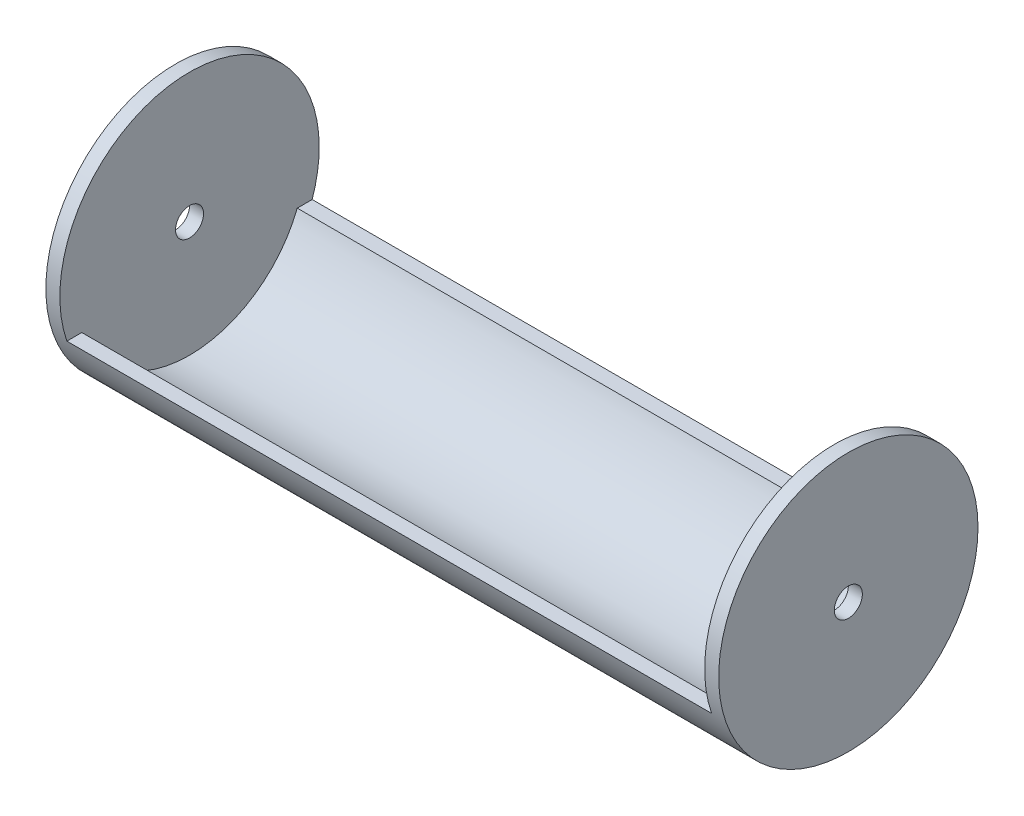
ISO-10303-21;
HEADER;
FILE_DESCRIPTION(('STEP AP214'),'2;1');
FILE_NAME('part.step','',(''),(''),'','','');
FILE_SCHEMA(('AUTOMOTIVE_DESIGN { 1 0 10303 214 1 1 1 1 }'));
ENDSEC;
DATA;
#1=APPLICATION_CONTEXT('core data for automotive mechanical design processes');
#2=APPLICATION_PROTOCOL_DEFINITION('international standard','automotive_design',2000,#1);
#3=PRODUCT_CONTEXT('',#1,'mechanical');
#4=PRODUCT('Part','Part','',(#3));
#5=PRODUCT_RELATED_PRODUCT_CATEGORY('part','',(#4));
#6=PRODUCT_DEFINITION_FORMATION('','',#4);
#7=PRODUCT_DEFINITION_CONTEXT('part definition',#1,'design');
#8=PRODUCT_DEFINITION('design','',#6,#7);
#9=PRODUCT_DEFINITION_SHAPE('','',#8);
#10=(LENGTH_UNIT() NAMED_UNIT(*) SI_UNIT(.MILLI.,.METRE.));
#11=(NAMED_UNIT(*) PLANE_ANGLE_UNIT() SI_UNIT($,.RADIAN.));
#12=(NAMED_UNIT(*) SI_UNIT($,.STERADIAN.) SOLID_ANGLE_UNIT());
#13=UNCERTAINTY_MEASURE_WITH_UNIT(LENGTH_MEASURE(1.E-05),#10,'distance_accuracy_value','');
#14=(GEOMETRIC_REPRESENTATION_CONTEXT(3) GLOBAL_UNCERTAINTY_ASSIGNED_CONTEXT((#13)) GLOBAL_UNIT_ASSIGNED_CONTEXT((#10,
#11,#12)) REPRESENTATION_CONTEXT('',''));
#15=CARTESIAN_POINT('',(0.,0.,0.));
#16=DIRECTION('',(0.,0.,1.));
#17=DIRECTION('',(1.,0.,0.));
#18=AXIS2_PLACEMENT_3D('',#15,#16,#17);
#19=CARTESIAN_POINT('',(-146.05,-19.05,-58.7375));
#20=DIRECTION('',(0.,-1.,0.));
#21=DIRECTION('',(0.,0.,-1.));
#22=AXIS2_PLACEMENT_3D('',#19,#20,#21);
#23=PLANE('',#22);
#24=DIRECTION('',(0.,0.,1.));
#25=VECTOR('',#24,1.);
#26=CARTESIAN_POINT('',(-146.05,-19.05,-58.7375));
#27=LINE('',#26,#25);
#28=CARTESIAN_POINT('',(-146.05,-19.05,-55.5625));
#29=VERTEX_POINT('',#28);
#30=CARTESIAN_POINT('',(-146.05,-19.05,-48.8011030228826));
#31=VERTEX_POINT('',#30);
#32=EDGE_CURVE('E103',#29,#31,#27,.T.);
#33=ORIENTED_EDGE('',*,*,#32,.T.);
#34=DIRECTION('',(-1.,0.,0.));
#35=VECTOR('',#34,1.);
#36=CARTESIAN_POINT('',(-152.4,-19.05,-48.8011030228826));
#37=LINE('',#36,#35);
#38=CARTESIAN_POINT('',(146.05,-19.05,-48.8011030228826));
#39=VERTEX_POINT('',#38);
#40=EDGE_CURVE('E93',#31,#39,#37,.F.);
#41=ORIENTED_EDGE('',*,*,#40,.T.);
#42=DIRECTION('',(0.,0.,1.));
#43=VECTOR('',#42,1.);
#44=CARTESIAN_POINT('',(146.05,-19.05,-58.7375));
#45=LINE('',#44,#43);
#46=CARTESIAN_POINT('',(146.05,-19.05,-55.5625));
#47=VERTEX_POINT('',#46);
#48=EDGE_CURVE('E100',#47,#39,#45,.T.);
#49=ORIENTED_EDGE('',*,*,#48,.F.);
#50=DIRECTION('',(-1.,0.,0.));
#51=VECTOR('',#50,1.);
#52=CARTESIAN_POINT('',(152.4,-19.05,-55.5625));
#53=LINE('',#52,#51);
#54=EDGE_CURVE('E11',#29,#47,#53,.F.);
#55=ORIENTED_EDGE('',*,*,#54,.F.);
#56=EDGE_LOOP('',(#33,#41,#49,#55));
#57=FACE_BOUND('',#56,.T.);
#58=ADVANCED_FACE('F50',(#57),#23,.F.);
#59=CARTESIAN_POINT('',(152.4,0.,0.));
#60=DIRECTION('',(-1.,0.,0.));
#61=DIRECTION('',(0.,0.,1.));
#62=AXIS2_PLACEMENT_3D('',#59,#60,#61);
#63=CYLINDRICAL_SURFACE('',#62,6.35);
#64=CARTESIAN_POINT('',(-146.05,0.,0.));
#65=DIRECTION('',(-1.,0.,0.));
#66=DIRECTION('',(0.,0.,1.));
#67=AXIS2_PLACEMENT_3D('',#64,#65,#66);
#68=CIRCLE('',#67,6.35);
#69=CARTESIAN_POINT('',(-146.05,0.,6.35));
#70=VERTEX_POINT('',#69);
#71=EDGE_CURVE('E119',#70,#70,#68,.T.);
#72=CARTESIAN_POINT('',(-152.4,0.,0.));
#73=DIRECTION('',(1.,0.,0.));
#74=DIRECTION('',(0.,0.,-1.));
#75=AXIS2_PLACEMENT_3D('',#72,#73,#74);
#76=CIRCLE('',#75,6.35);
#77=CARTESIAN_POINT('',(-152.4,0.,6.35));
#78=VERTEX_POINT('',#77);
#79=EDGE_CURVE('E121',#78,#78,#76,.T.);
#80=CARTESIAN_POINT('',(-146.05,0.,6.35));
#81=CARTESIAN_POINT('',(-146.116145833333,0.,6.35));
#82=CARTESIAN_POINT('',(-146.182291666667,0.,6.35));
#83=CARTESIAN_POINT('',(-146.314583333333,0.,6.35));
#84=CARTESIAN_POINT('',(-146.380729166667,0.,6.35));
#85=CARTESIAN_POINT('',(-146.513020833333,0.,6.35));
#86=CARTESIAN_POINT('',(-146.579166666667,0.,6.35));
#87=CARTESIAN_POINT('',(-146.711458333333,0.,6.35));
#88=CARTESIAN_POINT('',(-146.777604166667,0.,6.35));
#89=CARTESIAN_POINT('',(-146.909895833333,0.,6.35));
#90=CARTESIAN_POINT('',(-146.976041666667,0.,6.35));
#91=CARTESIAN_POINT('',(-147.108333333333,0.,6.35));
#92=CARTESIAN_POINT('',(-147.174479166667,0.,6.35));
#93=CARTESIAN_POINT('',(-147.306770833333,0.,6.35));
#94=CARTESIAN_POINT('',(-147.372916666667,0.,6.35));
#95=CARTESIAN_POINT('',(-147.505208333333,0.,6.35));
#96=CARTESIAN_POINT('',(-147.571354166667,0.,6.35));
#97=CARTESIAN_POINT('',(-147.703645833333,0.,6.35));
#98=CARTESIAN_POINT('',(-147.769791666667,0.,6.35));
#99=CARTESIAN_POINT('',(-147.902083333333,0.,6.35));
#100=CARTESIAN_POINT('',(-147.968229166667,0.,6.35));
#101=CARTESIAN_POINT('',(-148.100520833333,0.,6.35));
#102=CARTESIAN_POINT('',(-148.166666666667,0.,6.35));
#103=CARTESIAN_POINT('',(-148.298958333333,0.,6.35));
#104=CARTESIAN_POINT('',(-148.365104166667,0.,6.35));
#105=CARTESIAN_POINT('',(-148.497395833333,0.,6.35));
#106=CARTESIAN_POINT('',(-148.563541666667,0.,6.35));
#107=CARTESIAN_POINT('',(-148.695833333333,0.,6.35));
#108=CARTESIAN_POINT('',(-148.761979166667,0.,6.35));
#109=CARTESIAN_POINT('',(-148.894270833333,0.,6.35));
#110=CARTESIAN_POINT('',(-148.960416666667,0.,6.35));
#111=CARTESIAN_POINT('',(-149.092708333333,0.,6.35));
#112=CARTESIAN_POINT('',(-149.158854166667,0.,6.35));
#113=CARTESIAN_POINT('',(-149.291145833333,0.,6.35));
#114=CARTESIAN_POINT('',(-149.357291666667,0.,6.35));
#115=CARTESIAN_POINT('',(-149.489583333333,0.,6.35));
#116=CARTESIAN_POINT('',(-149.555729166667,0.,6.35));
#117=CARTESIAN_POINT('',(-149.688020833333,0.,6.35));
#118=CARTESIAN_POINT('',(-149.754166666667,0.,6.35));
#119=CARTESIAN_POINT('',(-149.886458333333,0.,6.35));
#120=CARTESIAN_POINT('',(-149.952604166667,0.,6.35));
#121=CARTESIAN_POINT('',(-150.084895833333,0.,6.35));
#122=CARTESIAN_POINT('',(-150.151041666667,0.,6.35));
#123=CARTESIAN_POINT('',(-150.283333333333,0.,6.35));
#124=CARTESIAN_POINT('',(-150.349479166667,0.,6.35));
#125=CARTESIAN_POINT('',(-150.481770833333,0.,6.35));
#126=CARTESIAN_POINT('',(-150.547916666667,0.,6.35));
#127=CARTESIAN_POINT('',(-150.680208333333,0.,6.35));
#128=CARTESIAN_POINT('',(-150.746354166667,0.,6.35));
#129=CARTESIAN_POINT('',(-150.878645833333,0.,6.35));
#130=CARTESIAN_POINT('',(-150.944791666667,0.,6.35));
#131=CARTESIAN_POINT('',(-151.077083333333,0.,6.35));
#132=CARTESIAN_POINT('',(-151.143229166667,0.,6.35));
#133=CARTESIAN_POINT('',(-151.275520833333,0.,6.35));
#134=CARTESIAN_POINT('',(-151.341666666667,0.,6.35));
#135=CARTESIAN_POINT('',(-151.473958333333,0.,6.35));
#136=CARTESIAN_POINT('',(-151.540104166667,0.,6.35));
#137=CARTESIAN_POINT('',(-151.672395833333,0.,6.35));
#138=CARTESIAN_POINT('',(-151.738541666667,0.,6.35));
#139=CARTESIAN_POINT('',(-151.870833333333,0.,6.35));
#140=CARTESIAN_POINT('',(-151.936979166667,0.,6.35));
#141=CARTESIAN_POINT('',(-152.069270833333,0.,6.35));
#142=CARTESIAN_POINT('',(-152.135416666667,0.,6.35));
#143=CARTESIAN_POINT('',(-152.267708333333,0.,6.35));
#144=CARTESIAN_POINT('',(-152.333854166667,0.,6.35));
#145=CARTESIAN_POINT('',(-152.4,0.,6.35));
#146=B_SPLINE_CURVE_WITH_KNOTS('',3,(#80,#81,#82,#83,#84,#85,#86,#87,#88,#89,#90,#91,#92,#93,
#94,#95,#96,#97,#98,#99,#100,#101,#102,#103,#104,#105,#106,#107,#108,#109,#110,#111,#112,#113,
#114,#115,#116,#117,#118,#119,#120,#121,#122,#123,#124,#125,#126,#127,#128,#129,#130,#131,#132,
#133,#134,#135,#136,#137,#138,#139,#140,#141,#142,#143,#144,#145),.UNSPECIFIED.,.F.,.F.,(4,2,2,
2,2,2,2,2,2,2,2,2,2,2,2,2,2,2,2,2,2,2,2,2,2,2,2,2,2,2,2,2,4),(0.,0.198437499999982,
0.396875000000019,0.5953125,0.793750000000037,0.992187500000019,1.190625,1.38906250000004,
1.58750000000002,1.7859375,1.98437500000004,2.18281250000002,2.38125,2.57968750000004,
2.77812500000002,2.97656250000006,3.17500000000004,3.37343750000002,3.57187500000006,
3.77031250000004,3.96875000000008,4.16718750000006,4.36562500000004,4.56406250000008,
4.76250000000006,4.96093750000004,5.15937500000008,5.35781250000006,5.55625000000004,
5.75468750000008,5.95312500000006,6.1515625000001,6.35000000000008),.UNSPECIFIED.);
#147=EDGE_CURVE('BSEAM171',#70,#78,#146,.T.);
#148=ORIENTED_EDGE('',*,*,#71,.F.);
#149=ORIENTED_EDGE('',*,*,#79,.F.);
#150=ORIENTED_EDGE('',*,*,#147,.T.);
#151=ORIENTED_EDGE('',*,*,#147,.F.);
#152=EDGE_LOOP('',(#148,#150,#149,#151));
#153=FACE_BOUND('',#152,.T.);
#154=ADVANCED_FACE('F171',(#153),#63,.F.);
#155=CARTESIAN_POINT('',(152.4,0.,0.));
#156=DIRECTION('',(1.,0.,0.));
#157=DIRECTION('',(0.,0.,-1.));
#158=AXIS2_PLACEMENT_3D('',#155,#156,#157);
#159=PLANE('',#158);
#160=CARTESIAN_POINT('',(152.4,0.,0.));
#161=DIRECTION('',(1.,0.,0.));
#162=DIRECTION('',(0.,0.,-1.));
#163=AXIS2_PLACEMENT_3D('',#160,#161,#162);
#164=CIRCLE('',#163,58.7375);
#165=CARTESIAN_POINT('',(152.4,0.,-58.7375));
#166=VERTEX_POINT('',#165);
#167=EDGE_CURVE('E135',#166,#166,#164,.T.);
#168=ORIENTED_EDGE('',*,*,#167,.T.);
#169=EDGE_LOOP('',(#168));
#170=FACE_BOUND('',#169,.T.);
#171=CARTESIAN_POINT('',(152.4,0.,0.));
#172=DIRECTION('',(1.,0.,0.));
#173=DIRECTION('',(0.,0.,-1.));
#174=AXIS2_PLACEMENT_3D('',#171,#172,#173);
#175=CIRCLE('',#174,6.35);
#176=CARTESIAN_POINT('',(152.4,0.,6.35));
#177=VERTEX_POINT('',#176);
#178=EDGE_CURVE('E123',#177,#177,#175,.T.);
#179=ORIENTED_EDGE('',*,*,#178,.F.);
#180=EDGE_LOOP('',(#179));
#181=FACE_BOUND('',#180,.T.);
#182=ADVANCED_FACE('F176',(#170,#181),#159,.T.);
#183=CARTESIAN_POINT('',(-152.4,0.,0.));
#184=DIRECTION('',(1.,0.,0.));
#185=DIRECTION('',(0.,0.,-1.));
#186=AXIS2_PLACEMENT_3D('',#183,#184,#185);
#187=PLANE('',#186);
#188=CARTESIAN_POINT('',(-152.4,0.,0.));
#189=DIRECTION('',(1.,0.,0.));
#190=DIRECTION('',(0.,0.,-1.));
#191=AXIS2_PLACEMENT_3D('',#188,#189,#190);
#192=CIRCLE('',#191,58.7375);
#193=CARTESIAN_POINT('',(-152.4,0.,-58.7375));
#194=VERTEX_POINT('',#193);
#195=EDGE_CURVE('E126',#194,#194,#192,.T.);
#196=ORIENTED_EDGE('',*,*,#195,.F.);
#197=EDGE_LOOP('',(#196));
#198=FACE_BOUND('',#197,.T.);
#199=ORIENTED_EDGE('',*,*,#79,.T.);
#200=EDGE_LOOP('',(#199));
#201=FACE_BOUND('',#200,.T.);
#202=ADVANCED_FACE('F238',(#198,#201),#187,.F.);
#203=CARTESIAN_POINT('',(152.4,0.,0.));
#204=DIRECTION('',(-1.,0.,0.));
#205=DIRECTION('',(0.,0.,1.));
#206=AXIS2_PLACEMENT_3D('',#203,#204,#205);
#207=CYLINDRICAL_SURFACE('',#206,58.7375);
#208=DIRECTION('',(-1.,0.,0.));
#209=VECTOR('',#208,1.);
#210=CARTESIAN_POINT('',(152.4,-19.05,55.5625));
#211=LINE('',#210,#209);
#212=CARTESIAN_POINT('',(146.05,-19.05,55.5625));
#213=VERTEX_POINT('',#212);
#214=CARTESIAN_POINT('',(-146.05,-19.05,55.5625));
#215=VERTEX_POINT('',#214);
#216=EDGE_CURVE('E57',#213,#215,#211,.T.);
#217=ORIENTED_EDGE('',*,*,#216,.T.);
#218=CARTESIAN_POINT('',(-146.05,0.,0.));
#219=DIRECTION('',(-1.,0.,0.));
#220=DIRECTION('',(0.,0.,1.));
#221=AXIS2_PLACEMENT_3D('',#218,#219,#220);
#222=CIRCLE('',#221,58.7375);
#223=EDGE_CURVE('E122',#215,#29,#222,.T.);
#224=ORIENTED_EDGE('',*,*,#223,.T.);
#225=ORIENTED_EDGE('',*,*,#54,.T.);
#226=CARTESIAN_POINT('',(146.05,0.,0.));
#227=DIRECTION('',(1.,0.,0.));
#228=DIRECTION('',(0.,0.,-1.));
#229=AXIS2_PLACEMENT_3D('',#226,#227,#228);
#230=CIRCLE('',#229,58.7375);
#231=EDGE_CURVE('E73',#47,#213,#230,.T.);
#232=ORIENTED_EDGE('',*,*,#231,.T.);
#233=EDGE_LOOP('',(#217,#224,#225,#232));
#234=FACE_BOUND('',#233,.T.);
#235=ORIENTED_EDGE('',*,*,#167,.F.);
#236=EDGE_LOOP('',(#235));
#237=FACE_BOUND('',#236,.T.);
#238=ORIENTED_EDGE('',*,*,#195,.T.);
#239=EDGE_LOOP('',(#238));
#240=FACE_BOUND('',#239,.T.);
#241=ADVANCED_FACE('F47',(#234,#237,#240),#207,.T.);
#242=CARTESIAN_POINT('',(146.05,0.,0.));
#243=DIRECTION('',(1.,0.,0.));
#244=DIRECTION('',(0.,0.,-1.));
#245=AXIS2_PLACEMENT_3D('',#242,#243,#244);
#246=CIRCLE('',#245,6.35);
#247=CARTESIAN_POINT('',(146.05,0.,6.35));
#248=VERTEX_POINT('',#247);
#249=EDGE_CURVE('E110',#248,#248,#246,.T.);
#250=CARTESIAN_POINT('',(146.05,0.,6.35));
#251=CARTESIAN_POINT('',(146.116145833333,0.,6.35));
#252=CARTESIAN_POINT('',(146.182291666667,0.,6.35));
#253=CARTESIAN_POINT('',(146.314583333333,0.,6.35));
#254=CARTESIAN_POINT('',(146.380729166667,0.,6.35));
#255=CARTESIAN_POINT('',(146.513020833333,0.,6.35));
#256=CARTESIAN_POINT('',(146.579166666667,0.,6.35));
#257=CARTESIAN_POINT('',(146.711458333333,0.,6.35));
#258=CARTESIAN_POINT('',(146.777604166667,0.,6.35));
#259=CARTESIAN_POINT('',(146.909895833333,0.,6.35));
#260=CARTESIAN_POINT('',(146.976041666667,0.,6.35));
#261=CARTESIAN_POINT('',(147.108333333333,0.,6.35));
#262=CARTESIAN_POINT('',(147.174479166667,0.,6.35));
#263=CARTESIAN_POINT('',(147.306770833333,0.,6.35));
#264=CARTESIAN_POINT('',(147.372916666667,0.,6.35));
#265=CARTESIAN_POINT('',(147.505208333333,0.,6.35));
#266=CARTESIAN_POINT('',(147.571354166667,0.,6.35));
#267=CARTESIAN_POINT('',(147.703645833333,0.,6.35));
#268=CARTESIAN_POINT('',(147.769791666667,0.,6.35));
#269=CARTESIAN_POINT('',(147.902083333333,0.,6.35));
#270=CARTESIAN_POINT('',(147.968229166667,0.,6.35));
#271=CARTESIAN_POINT('',(148.100520833333,0.,6.35));
#272=CARTESIAN_POINT('',(148.166666666667,0.,6.35));
#273=CARTESIAN_POINT('',(148.298958333333,0.,6.35));
#274=CARTESIAN_POINT('',(148.365104166667,0.,6.35));
#275=CARTESIAN_POINT('',(148.497395833333,0.,6.35));
#276=CARTESIAN_POINT('',(148.563541666667,0.,6.35));
#277=CARTESIAN_POINT('',(148.695833333333,0.,6.35));
#278=CARTESIAN_POINT('',(148.761979166667,0.,6.35));
#279=CARTESIAN_POINT('',(148.894270833333,0.,6.35));
#280=CARTESIAN_POINT('',(148.960416666667,0.,6.35));
#281=CARTESIAN_POINT('',(149.092708333333,0.,6.35));
#282=CARTESIAN_POINT('',(149.158854166667,0.,6.35));
#283=CARTESIAN_POINT('',(149.291145833333,0.,6.35));
#284=CARTESIAN_POINT('',(149.357291666667,0.,6.35));
#285=CARTESIAN_POINT('',(149.489583333333,0.,6.35));
#286=CARTESIAN_POINT('',(149.555729166667,0.,6.35));
#287=CARTESIAN_POINT('',(149.688020833333,0.,6.35));
#288=CARTESIAN_POINT('',(149.754166666667,0.,6.35));
#289=CARTESIAN_POINT('',(149.886458333333,0.,6.35));
#290=CARTESIAN_POINT('',(149.952604166667,0.,6.35));
#291=CARTESIAN_POINT('',(150.084895833333,0.,6.35));
#292=CARTESIAN_POINT('',(150.151041666667,0.,6.35));
#293=CARTESIAN_POINT('',(150.283333333333,0.,6.35));
#294=CARTESIAN_POINT('',(150.349479166667,0.,6.35));
#295=CARTESIAN_POINT('',(150.481770833333,0.,6.35));
#296=CARTESIAN_POINT('',(150.547916666667,0.,6.35));
#297=CARTESIAN_POINT('',(150.680208333333,0.,6.35));
#298=CARTESIAN_POINT('',(150.746354166667,0.,6.35));
#299=CARTESIAN_POINT('',(150.878645833333,0.,6.35));
#300=CARTESIAN_POINT('',(150.944791666667,0.,6.35));
#301=CARTESIAN_POINT('',(151.077083333333,0.,6.35));
#302=CARTESIAN_POINT('',(151.143229166667,0.,6.35));
#303=CARTESIAN_POINT('',(151.275520833333,0.,6.35));
#304=CARTESIAN_POINT('',(151.341666666667,0.,6.35));
#305=CARTESIAN_POINT('',(151.473958333333,0.,6.35));
#306=CARTESIAN_POINT('',(151.540104166667,0.,6.35));
#307=CARTESIAN_POINT('',(151.672395833333,0.,6.35));
#308=CARTESIAN_POINT('',(151.738541666667,0.,6.35));
#309=CARTESIAN_POINT('',(151.870833333333,0.,6.35));
#310=CARTESIAN_POINT('',(151.936979166667,0.,6.35));
#311=CARTESIAN_POINT('',(152.069270833333,0.,6.35));
#312=CARTESIAN_POINT('',(152.135416666667,0.,6.35));
#313=CARTESIAN_POINT('',(152.267708333333,0.,6.35));
#314=CARTESIAN_POINT('',(152.333854166667,0.,6.35));
#315=CARTESIAN_POINT('',(152.4,0.,6.35));
#316=B_SPLINE_CURVE_WITH_KNOTS('',3,(#250,#251,#252,#253,#254,#255,#256,#257,#258,#259,#260,
#261,#262,#263,#264,#265,#266,#267,#268,#269,#270,#271,#272,#273,#274,#275,#276,#277,#278,#279,
#280,#281,#282,#283,#284,#285,#286,#287,#288,#289,#290,#291,#292,#293,#294,#295,#296,#297,#298,
#299,#300,#301,#302,#303,#304,#305,#306,#307,#308,#309,#310,#311,#312,#313,#314,#315),
.UNSPECIFIED.,.F.,.F.,(4,2,2,2,2,2,2,2,2,2,2,2,2,2,2,2,2,2,2,2,2,2,2,2,2,2,2,2,2,2,2,2,4),(0.,
0.198437500000009,0.396875000000019,0.5953125,0.79375000000001,0.992187500000019,1.190625,
1.38906250000001,1.58750000000002,1.7859375,1.98437500000001,2.18281250000002,2.38125,
2.57968750000001,2.77812500000002,2.9765625,3.17500000000001,3.37343750000002,3.571875,
3.77031250000001,3.96875000000002,4.1671875,4.36562500000001,4.56406250000002,4.7625,
4.96093750000001,5.15937500000002,5.3578125,5.55625000000001,5.75468750000002,5.953125,
6.15156250000001,6.35000000000002),.UNSPECIFIED.);
#317=EDGE_CURVE('BSEAM170',#248,#177,#316,.T.);
#318=ORIENTED_EDGE('',*,*,#249,.F.);
#319=ORIENTED_EDGE('',*,*,#178,.T.);
#320=ORIENTED_EDGE('',*,*,#317,.T.);
#321=ORIENTED_EDGE('',*,*,#317,.F.);
#322=EDGE_LOOP('',(#318,#320,#319,#321));
#323=FACE_BOUND('',#322,.T.);
#324=ADVANCED_FACE('F170',(#323),#63,.F.);
#325=CARTESIAN_POINT('',(146.05,-19.05,48.8011030228826));
#326=VERTEX_POINT('',#325);
#327=EDGE_CURVE('E108',#326,#213,#45,.T.);
#328=ORIENTED_EDGE('',*,*,#327,.F.);
#329=DIRECTION('',(-1.,0.,0.));
#330=VECTOR('',#329,1.);
#331=CARTESIAN_POINT('',(152.4,-19.05,48.8011030228826));
#332=LINE('',#331,#330);
#333=CARTESIAN_POINT('',(-146.05,-19.05,48.8011030228826));
#334=VERTEX_POINT('',#333);
#335=EDGE_CURVE('E91',#326,#334,#332,.T.);
#336=ORIENTED_EDGE('',*,*,#335,.T.);
#337=EDGE_CURVE('E101',#334,#215,#27,.T.);
#338=ORIENTED_EDGE('',*,*,#337,.T.);
#339=ORIENTED_EDGE('',*,*,#216,.F.);
#340=EDGE_LOOP('',(#328,#336,#338,#339));
#341=FACE_BOUND('',#340,.T.);
#342=ADVANCED_FACE('F146',(#341),#23,.F.);
#343=CARTESIAN_POINT('',(-146.05,58.7375,-58.7375));
#344=DIRECTION('',(-1.,0.,0.));
#345=DIRECTION('',(0.,0.,1.));
#346=AXIS2_PLACEMENT_3D('',#343,#344,#345);
#347=PLANE('',#346);
#348=ORIENTED_EDGE('',*,*,#71,.T.);
#349=EDGE_LOOP('',(#348));
#350=FACE_BOUND('',#349,.T.);
#351=ORIENTED_EDGE('',*,*,#223,.F.);
#352=ORIENTED_EDGE('',*,*,#337,.F.);
#353=CARTESIAN_POINT('',(-146.05,0.,0.));
#354=DIRECTION('',(1.,0.,0.));
#355=DIRECTION('',(0.,0.,-1.));
#356=AXIS2_PLACEMENT_3D('',#353,#354,#355);
#357=CIRCLE('',#356,52.3875);
#358=EDGE_CURVE('E64',#334,#31,#357,.T.);
#359=ORIENTED_EDGE('',*,*,#358,.T.);
#360=ORIENTED_EDGE('',*,*,#32,.F.);
#361=EDGE_LOOP('',(#351,#352,#359,#360));
#362=FACE_BOUND('',#361,.T.);
#363=ADVANCED_FACE('F155',(#350,#362),#347,.F.);
#364=CARTESIAN_POINT('',(146.05,58.7375,-58.7375));
#365=DIRECTION('',(1.,0.,0.));
#366=DIRECTION('',(0.,0.,-1.));
#367=AXIS2_PLACEMENT_3D('',#364,#365,#366);
#368=PLANE('',#367);
#369=ORIENTED_EDGE('',*,*,#249,.T.);
#370=EDGE_LOOP('',(#369));
#371=FACE_BOUND('',#370,.T.);
#372=ORIENTED_EDGE('',*,*,#231,.F.);
#373=ORIENTED_EDGE('',*,*,#48,.T.);
#374=CARTESIAN_POINT('',(146.05,0.,0.));
#375=DIRECTION('',(1.,0.,0.));
#376=DIRECTION('',(0.,0.,-1.));
#377=AXIS2_PLACEMENT_3D('',#374,#375,#376);
#378=CIRCLE('',#377,52.3875);
#379=EDGE_CURVE('E90',#326,#39,#378,.T.);
#380=ORIENTED_EDGE('',*,*,#379,.F.);
#381=ORIENTED_EDGE('',*,*,#327,.T.);
#382=EDGE_LOOP('',(#372,#373,#380,#381));
#383=FACE_BOUND('',#382,.T.);
#384=ADVANCED_FACE('F102',(#371,#383),#368,.F.);
#385=CARTESIAN_POINT('',(152.4,0.,0.));
#386=DIRECTION('',(-1.,0.,0.));
#387=DIRECTION('',(0.,0.,1.));
#388=AXIS2_PLACEMENT_3D('',#385,#386,#387);
#389=CYLINDRICAL_SURFACE('',#388,52.3875);
#390=ORIENTED_EDGE('',*,*,#335,.F.);
#391=ORIENTED_EDGE('',*,*,#379,.T.);
#392=ORIENTED_EDGE('',*,*,#40,.F.);
#393=ORIENTED_EDGE('',*,*,#358,.F.);
#394=EDGE_LOOP('',(#390,#391,#392,#393));
#395=FACE_BOUND('',#394,.T.);
#396=ADVANCED_FACE('F88',(#395),#389,.F.);
#397=CLOSED_SHELL('',(#58,#154,#182,#202,#241,#324,#342,#363,#384,#396));
#398=MANIFOLD_SOLID_BREP('B2',#397);
#399=ADVANCED_BREP_SHAPE_REPRESENTATION('',(#18,#398),#14);
#400=SHAPE_DEFINITION_REPRESENTATION(#9,#399);
ENDSEC;
END-ISO-10303-21;
